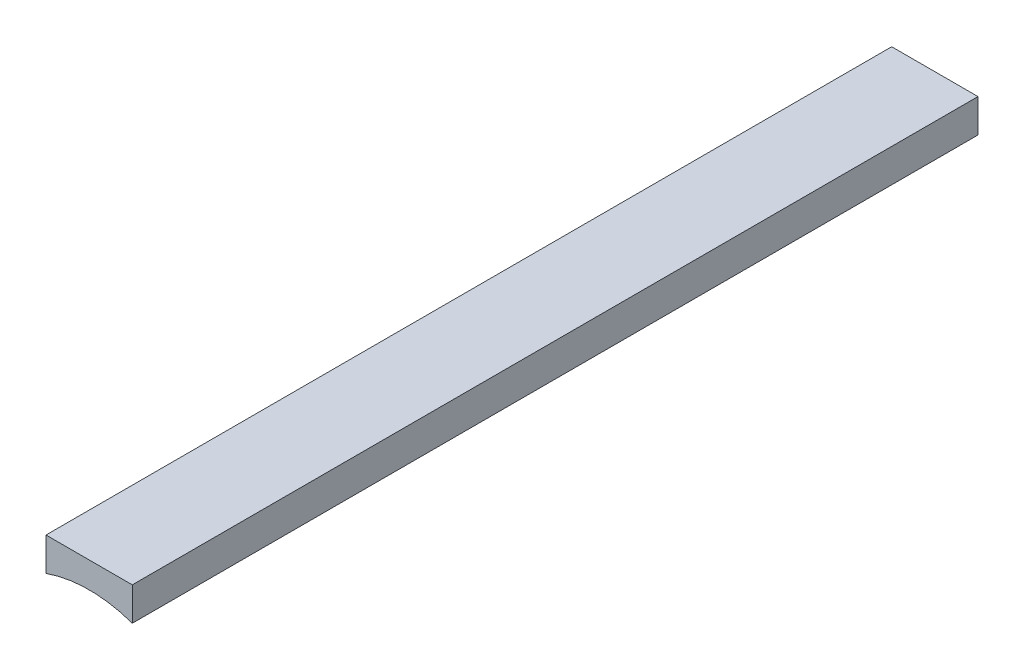
ISO-10303-21;
HEADER;
FILE_DESCRIPTION(('STEP AP214'),'2;1');
FILE_NAME('part.step','',(''),(''),'','','');
FILE_SCHEMA(('AUTOMOTIVE_DESIGN { 1 0 10303 214 1 1 1 1 }'));
ENDSEC;
DATA;
#1=APPLICATION_CONTEXT('core data for automotive mechanical design processes');
#2=APPLICATION_PROTOCOL_DEFINITION('international standard','automotive_design',2000,#1);
#3=PRODUCT_CONTEXT('',#1,'mechanical');
#4=PRODUCT('Part','Part','',(#3));
#5=PRODUCT_RELATED_PRODUCT_CATEGORY('part','',(#4));
#6=PRODUCT_DEFINITION_FORMATION('','',#4);
#7=PRODUCT_DEFINITION_CONTEXT('part definition',#1,'design');
#8=PRODUCT_DEFINITION('design','',#6,#7);
#9=PRODUCT_DEFINITION_SHAPE('','',#8);
#10=(LENGTH_UNIT() NAMED_UNIT(*) SI_UNIT(.MILLI.,.METRE.));
#11=(NAMED_UNIT(*) PLANE_ANGLE_UNIT() SI_UNIT($,.RADIAN.));
#12=(NAMED_UNIT(*) SI_UNIT($,.STERADIAN.) SOLID_ANGLE_UNIT());
#13=UNCERTAINTY_MEASURE_WITH_UNIT(LENGTH_MEASURE(1.E-05),#10,'distance_accuracy_value','');
#14=(GEOMETRIC_REPRESENTATION_CONTEXT(3) GLOBAL_UNCERTAINTY_ASSIGNED_CONTEXT((#13)) GLOBAL_UNIT_ASSIGNED_CONTEXT((#10,
#11,#12)) REPRESENTATION_CONTEXT('',''));
#15=CARTESIAN_POINT('',(0.,0.,0.));
#16=DIRECTION('',(0.,0.,1.));
#17=DIRECTION('',(1.,0.,0.));
#18=AXIS2_PLACEMENT_3D('',#15,#16,#17);
#19=CARTESIAN_POINT('',(0.,0.,98.));
#20=DIRECTION('',(0.,0.,-1.));
#21=DIRECTION('',(-1.,0.,0.));
#22=AXIS2_PLACEMENT_3D('',#19,#20,#21);
#23=CYLINDRICAL_SURFACE('',#22,15.);
#24=CARTESIAN_POINT('',(0.,0.,0.));
#25=DIRECTION('',(0.,0.,-1.));
#26=DIRECTION('',(1.,0.,0.));
#27=AXIS2_PLACEMENT_3D('',#24,#25,#26);
#28=CIRCLE('',#27,15.);
#29=CARTESIAN_POINT('',(-5.,14.142135623731,0.));
#30=VERTEX_POINT('',#29);
#31=CARTESIAN_POINT('',(5.,14.142135623731,0.));
#32=VERTEX_POINT('',#31);
#33=EDGE_CURVE('E111',#30,#32,#28,.T.);
#34=ORIENTED_EDGE('',*,*,#33,.T.);
#35=DIRECTION('',(0.,0.,-1.));
#36=VECTOR('',#35,1.);
#37=CARTESIAN_POINT('',(5.,14.142135623731,98.));
#38=LINE('',#37,#36);
#39=CARTESIAN_POINT('',(5.,14.142135623731,98.));
#40=VERTEX_POINT('',#39);
#41=EDGE_CURVE('E11',#40,#32,#38,.T.);
#42=ORIENTED_EDGE('',*,*,#41,.F.);
#43=CARTESIAN_POINT('',(0.,0.,98.));
#44=DIRECTION('',(0.,0.,-1.));
#45=DIRECTION('',(1.,0.,0.));
#46=AXIS2_PLACEMENT_3D('',#43,#44,#45);
#47=CIRCLE('',#46,15.);
#48=CARTESIAN_POINT('',(-5.,14.142135623731,98.));
#49=VERTEX_POINT('',#48);
#50=EDGE_CURVE('E95',#49,#40,#47,.T.);
#51=ORIENTED_EDGE('',*,*,#50,.F.);
#52=DIRECTION('',(0.,0.,-1.));
#53=VECTOR('',#52,1.);
#54=CARTESIAN_POINT('',(-5.,14.142135623731,98.));
#55=LINE('',#54,#53);
#56=EDGE_CURVE('E107',#49,#30,#55,.T.);
#57=ORIENTED_EDGE('',*,*,#56,.T.);
#58=EDGE_LOOP('',(#34,#42,#51,#57));
#59=FACE_BOUND('',#58,.T.);
#60=ADVANCED_FACE('F43',(#59),#23,.F.);
#61=CARTESIAN_POINT('',(5.,18.,98.));
#62=DIRECTION('',(-1.,0.,0.));
#63=DIRECTION('',(0.,0.,1.));
#64=AXIS2_PLACEMENT_3D('',#61,#62,#63);
#65=PLANE('',#64);
#66=DIRECTION('',(0.,1.,0.));
#67=VECTOR('',#66,1.);
#68=CARTESIAN_POINT('',(5.,18.,0.));
#69=LINE('',#68,#67);
#70=CARTESIAN_POINT('',(5.,18.,0.));
#71=VERTEX_POINT('',#70);
#72=EDGE_CURVE('E100',#32,#71,#69,.T.);
#73=ORIENTED_EDGE('',*,*,#72,.T.);
#74=DIRECTION('',(0.,0.,-1.));
#75=VECTOR('',#74,1.);
#76=CARTESIAN_POINT('',(5.,18.,98.));
#77=LINE('',#76,#75);
#78=CARTESIAN_POINT('',(5.,18.,98.));
#79=VERTEX_POINT('',#78);
#80=EDGE_CURVE('E52',#79,#71,#77,.T.);
#81=ORIENTED_EDGE('',*,*,#80,.F.);
#82=DIRECTION('',(0.,1.,0.));
#83=VECTOR('',#82,1.);
#84=CARTESIAN_POINT('',(5.,18.,98.));
#85=LINE('',#84,#83);
#86=EDGE_CURVE('E90',#40,#79,#85,.T.);
#87=ORIENTED_EDGE('',*,*,#86,.F.);
#88=ORIENTED_EDGE('',*,*,#41,.T.);
#89=EDGE_LOOP('',(#73,#81,#87,#88));
#90=FACE_BOUND('',#89,.T.);
#91=ADVANCED_FACE('F99',(#90),#65,.F.);
#92=CARTESIAN_POINT('',(-5.,18.,98.));
#93=DIRECTION('',(0.,-1.,0.));
#94=DIRECTION('',(0.,0.,-1.));
#95=AXIS2_PLACEMENT_3D('',#92,#93,#94);
#96=PLANE('',#95);
#97=DIRECTION('',(-1.,0.,0.));
#98=VECTOR('',#97,1.);
#99=CARTESIAN_POINT('',(-5.,18.,0.));
#100=LINE('',#99,#98);
#101=CARTESIAN_POINT('',(-5.,18.,0.));
#102=VERTEX_POINT('',#101);
#103=EDGE_CURVE('E77',#71,#102,#100,.T.);
#104=ORIENTED_EDGE('',*,*,#103,.T.);
#105=DIRECTION('',(0.,0.,-1.));
#106=VECTOR('',#105,1.);
#107=CARTESIAN_POINT('',(-5.,18.,98.));
#108=LINE('',#107,#106);
#109=CARTESIAN_POINT('',(-5.,18.,98.));
#110=VERTEX_POINT('',#109);
#111=EDGE_CURVE('E102',#110,#102,#108,.T.);
#112=ORIENTED_EDGE('',*,*,#111,.F.);
#113=DIRECTION('',(-1.,0.,0.));
#114=VECTOR('',#113,1.);
#115=CARTESIAN_POINT('',(-5.,18.,98.));
#116=LINE('',#115,#114);
#117=EDGE_CURVE('E93',#79,#110,#116,.T.);
#118=ORIENTED_EDGE('',*,*,#117,.F.);
#119=ORIENTED_EDGE('',*,*,#80,.T.);
#120=EDGE_LOOP('',(#104,#112,#118,#119));
#121=FACE_BOUND('',#120,.T.);
#122=ADVANCED_FACE('F103',(#121),#96,.F.);
#123=CARTESIAN_POINT('',(-5.,18.,98.));
#124=DIRECTION('',(1.,0.,0.));
#125=DIRECTION('',(0.,0.,-1.));
#126=AXIS2_PLACEMENT_3D('',#123,#124,#125);
#127=PLANE('',#126);
#128=DIRECTION('',(0.,-1.,0.));
#129=VECTOR('',#128,1.);
#130=CARTESIAN_POINT('',(-5.,18.,0.));
#131=LINE('',#130,#129);
#132=EDGE_CURVE('E83',#102,#30,#131,.T.);
#133=ORIENTED_EDGE('',*,*,#132,.T.);
#134=ORIENTED_EDGE('',*,*,#56,.F.);
#135=DIRECTION('',(0.,-1.,0.));
#136=VECTOR('',#135,1.);
#137=CARTESIAN_POINT('',(-5.,18.,98.));
#138=LINE('',#137,#136);
#139=EDGE_CURVE('E60',#110,#49,#138,.T.);
#140=ORIENTED_EDGE('',*,*,#139,.F.);
#141=ORIENTED_EDGE('',*,*,#111,.T.);
#142=EDGE_LOOP('',(#133,#134,#140,#141));
#143=FACE_BOUND('',#142,.T.);
#144=ADVANCED_FACE('F124',(#143),#127,.F.);
#145=CARTESIAN_POINT('',(0.,0.,98.));
#146=DIRECTION('',(0.,0.,1.));
#147=DIRECTION('',(1.,0.,0.));
#148=AXIS2_PLACEMENT_3D('',#145,#146,#147);
#149=PLANE('',#148);
#150=ORIENTED_EDGE('',*,*,#50,.T.);
#151=ORIENTED_EDGE('',*,*,#86,.T.);
#152=ORIENTED_EDGE('',*,*,#117,.T.);
#153=ORIENTED_EDGE('',*,*,#139,.T.);
#154=EDGE_LOOP('',(#150,#151,#152,#153));
#155=FACE_BOUND('',#154,.T.);
#156=ADVANCED_FACE('F91',(#155),#149,.T.);
#157=CARTESIAN_POINT('',(0.,0.,0.));
#158=DIRECTION('',(0.,0.,1.));
#159=DIRECTION('',(1.,0.,0.));
#160=AXIS2_PLACEMENT_3D('',#157,#158,#159);
#161=PLANE('',#160);
#162=ORIENTED_EDGE('',*,*,#33,.F.);
#163=ORIENTED_EDGE('',*,*,#132,.F.);
#164=ORIENTED_EDGE('',*,*,#103,.F.);
#165=ORIENTED_EDGE('',*,*,#72,.F.);
#166=EDGE_LOOP('',(#162,#163,#164,#165));
#167=FACE_BOUND('',#166,.T.);
#168=ADVANCED_FACE('F127',(#167),#161,.F.);
#169=CLOSED_SHELL('',(#60,#91,#122,#144,#156,#168));
#170=MANIFOLD_SOLID_BREP('B2',#169);
#171=ADVANCED_BREP_SHAPE_REPRESENTATION('',(#18,#170),#14);
#172=SHAPE_DEFINITION_REPRESENTATION(#9,#171);
ENDSEC;
END-ISO-10303-21;
